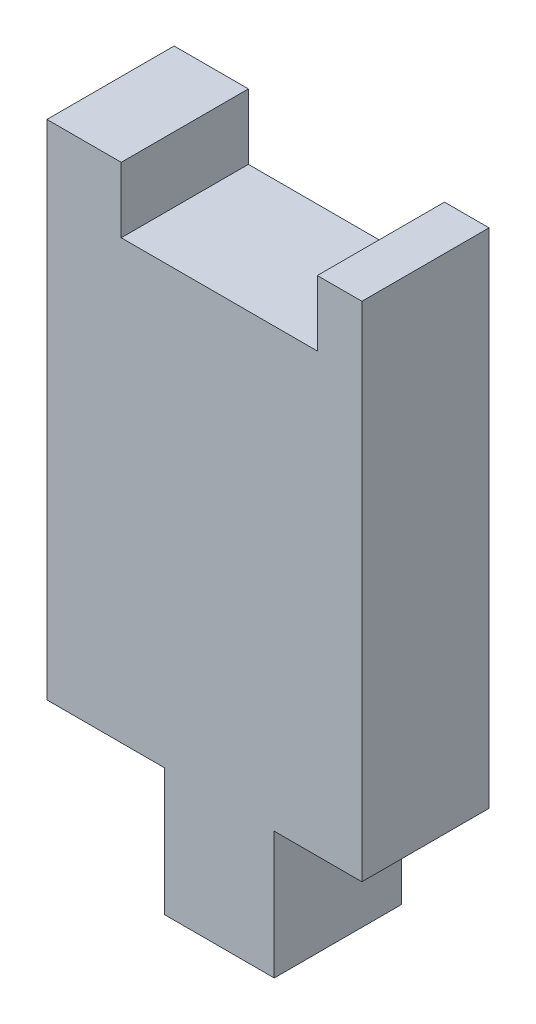
ISO-10303-21;
HEADER;
FILE_DESCRIPTION(('STEP AP214'),'2;1');
FILE_NAME('part.step','',(''),(''),'','','');
FILE_SCHEMA(('AUTOMOTIVE_DESIGN { 1 0 10303 214 1 1 1 1 }'));
ENDSEC;
DATA;
#1=APPLICATION_CONTEXT('core data for automotive mechanical design processes');
#2=APPLICATION_PROTOCOL_DEFINITION('international standard','automotive_design',2000,#1);
#3=PRODUCT_CONTEXT('',#1,'mechanical');
#4=PRODUCT('Part','Part','',(#3));
#5=PRODUCT_RELATED_PRODUCT_CATEGORY('part','',(#4));
#6=PRODUCT_DEFINITION_FORMATION('','',#4);
#7=PRODUCT_DEFINITION_CONTEXT('part definition',#1,'design');
#8=PRODUCT_DEFINITION('design','',#6,#7);
#9=PRODUCT_DEFINITION_SHAPE('','',#8);
#10=(LENGTH_UNIT() NAMED_UNIT(*) SI_UNIT(.MILLI.,.METRE.));
#11=(NAMED_UNIT(*) PLANE_ANGLE_UNIT() SI_UNIT($,.RADIAN.));
#12=(NAMED_UNIT(*) SI_UNIT($,.STERADIAN.) SOLID_ANGLE_UNIT());
#13=UNCERTAINTY_MEASURE_WITH_UNIT(LENGTH_MEASURE(1.E-05),#10,'distance_accuracy_value','');
#14=(GEOMETRIC_REPRESENTATION_CONTEXT(3) GLOBAL_UNCERTAINTY_ASSIGNED_CONTEXT((#13)) GLOBAL_UNIT_ASSIGNED_CONTEXT((#10,
#11,#12)) REPRESENTATION_CONTEXT('',''));
#15=CARTESIAN_POINT('',(0.,0.,0.));
#16=DIRECTION('',(0.,0.,1.));
#17=DIRECTION('',(1.,0.,0.));
#18=AXIS2_PLACEMENT_3D('',#15,#16,#17);
#19=CARTESIAN_POINT('',(0.,0.,5.4356));
#20=DIRECTION('',(0.,1.,0.));
#21=DIRECTION('',(0.,0.,1.));
#22=AXIS2_PLACEMENT_3D('',#19,#20,#21);
#23=PLANE('',#22);
#24=DIRECTION('',(1.,0.,0.));
#25=VECTOR('',#24,1.);
#26=CARTESIAN_POINT('',(0.,0.,0.));
#27=LINE('',#26,#25);
#28=CARTESIAN_POINT('',(3.7465,0.,0.));
#29=VERTEX_POINT('',#28);
#30=CARTESIAN_POINT('',(8.4455,0.,0.));
#31=VERTEX_POINT('',#30);
#32=EDGE_CURVE('E201',#29,#31,#27,.T.);
#33=ORIENTED_EDGE('',*,*,#32,.T.);
#34=DIRECTION('',(0.,0.,1.));
#35=VECTOR('',#34,1.);
#36=CARTESIAN_POINT('',(8.4455,0.,0.));
#37=LINE('',#36,#35);
#38=CARTESIAN_POINT('',(8.4455,0.,5.4356));
#39=VERTEX_POINT('',#38);
#40=EDGE_CURVE('E183',#31,#39,#37,.T.);
#41=ORIENTED_EDGE('',*,*,#40,.T.);
#42=DIRECTION('',(1.,0.,0.));
#43=VECTOR('',#42,1.);
#44=CARTESIAN_POINT('',(0.,0.,5.4356));
#45=LINE('',#44,#43);
#46=CARTESIAN_POINT('',(3.7465,0.,5.4356));
#47=VERTEX_POINT('',#46);
#48=EDGE_CURVE('E203',#47,#39,#45,.T.);
#49=ORIENTED_EDGE('',*,*,#48,.F.);
#50=DIRECTION('',(0.,0.,1.));
#51=VECTOR('',#50,1.);
#52=CARTESIAN_POINT('',(3.7465,0.,0.));
#53=LINE('',#52,#51);
#54=EDGE_CURVE('E194',#29,#47,#53,.T.);
#55=ORIENTED_EDGE('',*,*,#54,.F.);
#56=EDGE_LOOP('',(#33,#41,#49,#55));
#57=FACE_BOUND('',#56,.T.);
#58=ADVANCED_FACE('F32',(#57),#23,.F.);
#59=CARTESIAN_POINT('',(12.192,0.,5.4356));
#60=DIRECTION('',(-1.,0.,0.));
#61=DIRECTION('',(0.,-1.,0.));
#62=AXIS2_PLACEMENT_3D('',#59,#60,#61);
#63=PLANE('',#62);
#64=DIRECTION('',(0.,1.,0.));
#65=VECTOR('',#64,1.);
#66=CARTESIAN_POINT('',(12.192,0.,0.));
#67=LINE('',#66,#65);
#68=CARTESIAN_POINT('',(12.192,5.4356,0.));
#69=VERTEX_POINT('',#68);
#70=CARTESIAN_POINT('',(12.192,26.924,0.));
#71=VERTEX_POINT('',#70);
#72=EDGE_CURVE('E207',#69,#71,#67,.T.);
#73=ORIENTED_EDGE('',*,*,#72,.T.);
#74=DIRECTION('',(0.,0.,1.));
#75=VECTOR('',#74,1.);
#76=CARTESIAN_POINT('',(12.192,26.924,-4.99999999997031E-05));
#77=LINE('',#76,#75);
#78=CARTESIAN_POINT('',(12.192,26.924,5.4356));
#79=VERTEX_POINT('',#78);
#80=EDGE_CURVE('E151',#71,#79,#77,.T.);
#81=ORIENTED_EDGE('',*,*,#80,.T.);
#82=DIRECTION('',(0.,1.,0.));
#83=VECTOR('',#82,1.);
#84=CARTESIAN_POINT('',(12.192,0.,5.4356));
#85=LINE('',#84,#83);
#86=CARTESIAN_POINT('',(12.192,5.4356,5.4356));
#87=VERTEX_POINT('',#86);
#88=EDGE_CURVE('E206',#87,#79,#85,.T.);
#89=ORIENTED_EDGE('',*,*,#88,.F.);
#90=DIRECTION('',(0.,0.,1.));
#91=VECTOR('',#90,1.);
#92=CARTESIAN_POINT('',(12.192,5.4356,0.));
#93=LINE('',#92,#91);
#94=EDGE_CURVE('E180',#69,#87,#93,.T.);
#95=ORIENTED_EDGE('',*,*,#94,.F.);
#96=EDGE_LOOP('',(#73,#81,#89,#95));
#97=FACE_BOUND('',#96,.T.);
#98=ADVANCED_FACE('F254',(#97),#63,.F.);
#99=CARTESIAN_POINT('',(0.,0.,5.4356));
#100=DIRECTION('',(0.,0.,-1.));
#101=DIRECTION('',(-1.,0.,0.));
#102=AXIS2_PLACEMENT_3D('',#99,#100,#101);
#103=PLANE('',#102);
#104=DIRECTION('',(1.,0.,0.));
#105=VECTOR('',#104,1.);
#106=CARTESIAN_POINT('',(1.905,24.13,5.4356));
#107=LINE('',#106,#105);
#108=CARTESIAN_POINT('',(1.905,24.13,5.4356));
#109=VERTEX_POINT('',#108);
#110=CARTESIAN_POINT('',(10.287,24.13,5.4356));
#111=VERTEX_POINT('',#110);
#112=EDGE_CURVE('E137',#109,#111,#107,.T.);
#113=ORIENTED_EDGE('',*,*,#112,.F.);
#114=DIRECTION('',(0.,1.,0.));
#115=VECTOR('',#114,1.);
#116=CARTESIAN_POINT('',(1.905,27.178,5.4356));
#117=LINE('',#116,#115);
#118=CARTESIAN_POINT('',(1.905,26.924,5.4356));
#119=VERTEX_POINT('',#118);
#120=EDGE_CURVE('E121',#109,#119,#117,.T.);
#121=ORIENTED_EDGE('',*,*,#120,.T.);
#122=DIRECTION('',(1.,0.,0.));
#123=VECTOR('',#122,1.);
#124=CARTESIAN_POINT('',(-1.27,26.924,5.4356));
#125=LINE('',#124,#123);
#126=CARTESIAN_POINT('',(-1.27,26.924,5.4356));
#127=VERTEX_POINT('',#126);
#128=EDGE_CURVE('E155',#127,#119,#125,.T.);
#129=ORIENTED_EDGE('',*,*,#128,.F.);
#130=DIRECTION('',(0.,-1.,0.));
#131=VECTOR('',#130,1.);
#132=CARTESIAN_POINT('',(-1.27,27.178,5.4356));
#133=LINE('',#132,#131);
#134=CARTESIAN_POINT('',(-1.27,5.4356,5.4356));
#135=VERTEX_POINT('',#134);
#136=EDGE_CURVE('E159',#127,#135,#133,.T.);
#137=ORIENTED_EDGE('',*,*,#136,.T.);
#138=DIRECTION('',(-1.,0.,0.));
#139=VECTOR('',#138,1.);
#140=CARTESIAN_POINT('',(3.7465,5.4356,5.4356));
#141=LINE('',#140,#139);
#142=CARTESIAN_POINT('',(3.7465,5.4356,5.4356));
#143=VERTEX_POINT('',#142);
#144=EDGE_CURVE('E191',#143,#135,#141,.T.);
#145=ORIENTED_EDGE('',*,*,#144,.F.);
#146=DIRECTION('',(0.,1.,0.));
#147=VECTOR('',#146,1.);
#148=CARTESIAN_POINT('',(3.7465,0.,5.4356));
#149=LINE('',#148,#147);
#150=EDGE_CURVE('E182',#47,#143,#149,.T.);
#151=ORIENTED_EDGE('',*,*,#150,.F.);
#152=ORIENTED_EDGE('',*,*,#48,.T.);
#153=DIRECTION('',(0.,-1.,0.));
#154=VECTOR('',#153,1.);
#155=CARTESIAN_POINT('',(8.4455,0.,5.4356));
#156=LINE('',#155,#154);
#157=CARTESIAN_POINT('',(8.4455,5.4356,5.4356));
#158=VERTEX_POINT('',#157);
#159=EDGE_CURVE('E172',#158,#39,#156,.T.);
#160=ORIENTED_EDGE('',*,*,#159,.F.);
#161=DIRECTION('',(-1.,0.,0.));
#162=VECTOR('',#161,1.);
#163=CARTESIAN_POINT('',(8.4455,5.4356,5.4356));
#164=LINE('',#163,#162);
#165=EDGE_CURVE('E176',#87,#158,#164,.T.);
#166=ORIENTED_EDGE('',*,*,#165,.F.);
#167=ORIENTED_EDGE('',*,*,#88,.T.);
#168=DIRECTION('',(1.,0.,0.));
#169=VECTOR('',#168,1.);
#170=CARTESIAN_POINT('',(10.287,26.924,5.4356));
#171=LINE('',#170,#169);
#172=CARTESIAN_POINT('',(10.287,26.924,5.4356));
#173=VERTEX_POINT('',#172);
#174=EDGE_CURVE('E148',#173,#79,#171,.T.);
#175=ORIENTED_EDGE('',*,*,#174,.F.);
#176=DIRECTION('',(0.,-1.,0.));
#177=VECTOR('',#176,1.);
#178=CARTESIAN_POINT('',(10.287,27.178,5.4356));
#179=LINE('',#178,#177);
#180=EDGE_CURVE('E144',#173,#111,#179,.T.);
#181=ORIENTED_EDGE('',*,*,#180,.T.);
#182=EDGE_LOOP('',(#113,#121,#129,#137,#145,#151,#152,#160,#166,#167,#175,#181));
#183=FACE_BOUND('',#182,.T.);
#184=ADVANCED_FACE('F141',(#183),#103,.F.);
#185=CARTESIAN_POINT('',(0.,0.,0.));
#186=DIRECTION('',(0.,0.,-1.));
#187=DIRECTION('',(-1.,0.,0.));
#188=AXIS2_PLACEMENT_3D('',#185,#186,#187);
#189=PLANE('',#188);
#190=DIRECTION('',(0.,1.,0.));
#191=VECTOR('',#190,1.);
#192=CARTESIAN_POINT('',(1.905,27.178,0.));
#193=LINE('',#192,#191);
#194=CARTESIAN_POINT('',(1.905,24.13,0.));
#195=VERTEX_POINT('',#194);
#196=CARTESIAN_POINT('',(1.905,26.924,0.));
#197=VERTEX_POINT('',#196);
#198=EDGE_CURVE('E130',#195,#197,#193,.T.);
#199=ORIENTED_EDGE('',*,*,#198,.F.);
#200=DIRECTION('',(-1.,0.,0.));
#201=VECTOR('',#200,1.);
#202=CARTESIAN_POINT('',(0.,24.13,0.));
#203=LINE('',#202,#201);
#204=CARTESIAN_POINT('',(10.287,24.13,0.));
#205=VERTEX_POINT('',#204);
#206=EDGE_CURVE('E11',#205,#195,#203,.T.);
#207=ORIENTED_EDGE('',*,*,#206,.F.);
#208=DIRECTION('',(0.,-1.,0.));
#209=VECTOR('',#208,1.);
#210=CARTESIAN_POINT('',(10.287,27.178,0.));
#211=LINE('',#210,#209);
#212=CARTESIAN_POINT('',(10.287,26.924,0.));
#213=VERTEX_POINT('',#212);
#214=EDGE_CURVE('E131',#213,#205,#211,.T.);
#215=ORIENTED_EDGE('',*,*,#214,.F.);
#216=DIRECTION('',(-1.,0.,0.));
#217=VECTOR('',#216,1.);
#218=CARTESIAN_POINT('',(0.,26.924,0.));
#219=LINE('',#218,#217);
#220=EDGE_CURVE('E46',#71,#213,#219,.T.);
#221=ORIENTED_EDGE('',*,*,#220,.F.);
#222=ORIENTED_EDGE('',*,*,#72,.F.);
#223=DIRECTION('',(-1.,0.,0.));
#224=VECTOR('',#223,1.);
#225=CARTESIAN_POINT('',(8.4455,5.4356,0.));
#226=LINE('',#225,#224);
#227=CARTESIAN_POINT('',(8.4455,5.4356,0.));
#228=VERTEX_POINT('',#227);
#229=EDGE_CURVE('E168',#69,#228,#226,.T.);
#230=ORIENTED_EDGE('',*,*,#229,.T.);
#231=DIRECTION('',(0.,-1.,0.));
#232=VECTOR('',#231,1.);
#233=CARTESIAN_POINT('',(8.4455,0.,0.));
#234=LINE('',#233,#232);
#235=EDGE_CURVE('E171',#228,#31,#234,.T.);
#236=ORIENTED_EDGE('',*,*,#235,.T.);
#237=ORIENTED_EDGE('',*,*,#32,.F.);
#238=DIRECTION('',(0.,1.,0.));
#239=VECTOR('',#238,1.);
#240=CARTESIAN_POINT('',(3.7465,0.,0.));
#241=LINE('',#240,#239);
#242=CARTESIAN_POINT('',(3.7465,5.4356,0.));
#243=VERTEX_POINT('',#242);
#244=EDGE_CURVE('E187',#29,#243,#241,.T.);
#245=ORIENTED_EDGE('',*,*,#244,.T.);
#246=DIRECTION('',(-1.,0.,0.));
#247=VECTOR('',#246,1.);
#248=CARTESIAN_POINT('',(3.7465,5.4356,0.));
#249=LINE('',#248,#247);
#250=CARTESIAN_POINT('',(-1.27,5.4356,0.));
#251=VERTEX_POINT('',#250);
#252=EDGE_CURVE('E190',#243,#251,#249,.T.);
#253=ORIENTED_EDGE('',*,*,#252,.T.);
#254=DIRECTION('',(0.,-1.,0.));
#255=VECTOR('',#254,1.);
#256=CARTESIAN_POINT('',(-1.27,27.178,0.));
#257=LINE('',#256,#255);
#258=CARTESIAN_POINT('',(-1.27,26.924,0.));
#259=VERTEX_POINT('',#258);
#260=EDGE_CURVE('E161',#259,#251,#257,.T.);
#261=ORIENTED_EDGE('',*,*,#260,.F.);
#262=DIRECTION('',(-1.,0.,0.));
#263=VECTOR('',#262,1.);
#264=CARTESIAN_POINT('',(0.,26.924,0.));
#265=LINE('',#264,#263);
#266=EDGE_CURVE('E54',#197,#259,#265,.T.);
#267=ORIENTED_EDGE('',*,*,#266,.F.);
#268=EDGE_LOOP('',(#199,#207,#215,#221,#222,#230,#236,#237,#245,#253,#261,#267));
#269=FACE_BOUND('',#268,.T.);
#270=ADVANCED_FACE('F227',(#269),#189,.T.);
#271=CARTESIAN_POINT('',(3.7465,5.4356,0.));
#272=DIRECTION('',(0.,1.,0.));
#273=DIRECTION('',(0.,0.,1.));
#274=AXIS2_PLACEMENT_3D('',#271,#272,#273);
#275=PLANE('',#274);
#276=ORIENTED_EDGE('',*,*,#144,.T.);
#277=DIRECTION('',(0.,0.,1.));
#278=VECTOR('',#277,1.);
#279=CARTESIAN_POINT('',(-1.27,5.4356,-21.7794595378306));
#280=LINE('',#279,#278);
#281=EDGE_CURVE('E163',#251,#135,#280,.T.);
#282=ORIENTED_EDGE('',*,*,#281,.F.);
#283=ORIENTED_EDGE('',*,*,#252,.F.);
#284=DIRECTION('',(0.,0.,1.));
#285=VECTOR('',#284,1.);
#286=CARTESIAN_POINT('',(3.7465,5.4356,0.));
#287=LINE('',#286,#285);
#288=EDGE_CURVE('E199',#243,#143,#287,.T.);
#289=ORIENTED_EDGE('',*,*,#288,.T.);
#290=EDGE_LOOP('',(#276,#282,#283,#289));
#291=FACE_BOUND('',#290,.T.);
#292=ADVANCED_FACE('F237',(#291),#275,.F.);
#293=CARTESIAN_POINT('',(3.7465,0.,0.));
#294=DIRECTION('',(1.,0.,0.));
#295=DIRECTION('',(0.,0.,-1.));
#296=AXIS2_PLACEMENT_3D('',#293,#294,#295);
#297=PLANE('',#296);
#298=ORIENTED_EDGE('',*,*,#150,.T.);
#299=ORIENTED_EDGE('',*,*,#288,.F.);
#300=ORIENTED_EDGE('',*,*,#244,.F.);
#301=ORIENTED_EDGE('',*,*,#54,.T.);
#302=EDGE_LOOP('',(#298,#299,#300,#301));
#303=FACE_BOUND('',#302,.T.);
#304=ADVANCED_FACE('F240',(#303),#297,.F.);
#305=CARTESIAN_POINT('',(8.4455,5.4356,0.));
#306=DIRECTION('',(0.,1.,0.));
#307=DIRECTION('',(-1.,0.,0.));
#308=AXIS2_PLACEMENT_3D('',#305,#306,#307);
#309=PLANE('',#308);
#310=ORIENTED_EDGE('',*,*,#165,.T.);
#311=DIRECTION('',(0.,0.,1.));
#312=VECTOR('',#311,1.);
#313=CARTESIAN_POINT('',(8.4455,5.4356,0.));
#314=LINE('',#313,#312);
#315=EDGE_CURVE('E175',#228,#158,#314,.T.);
#316=ORIENTED_EDGE('',*,*,#315,.F.);
#317=ORIENTED_EDGE('',*,*,#229,.F.);
#318=ORIENTED_EDGE('',*,*,#94,.T.);
#319=EDGE_LOOP('',(#310,#316,#317,#318));
#320=FACE_BOUND('',#319,.T.);
#321=ADVANCED_FACE('F252',(#320),#309,.F.);
#322=CARTESIAN_POINT('',(8.4455,0.,0.));
#323=DIRECTION('',(-1.,0.,0.));
#324=DIRECTION('',(0.,0.,1.));
#325=AXIS2_PLACEMENT_3D('',#322,#323,#324);
#326=PLANE('',#325);
#327=ORIENTED_EDGE('',*,*,#159,.T.);
#328=ORIENTED_EDGE('',*,*,#40,.F.);
#329=ORIENTED_EDGE('',*,*,#235,.F.);
#330=ORIENTED_EDGE('',*,*,#315,.T.);
#331=EDGE_LOOP('',(#327,#328,#329,#330));
#332=FACE_BOUND('',#331,.T.);
#333=ADVANCED_FACE('F248',(#332),#326,.F.);
#334=CARTESIAN_POINT('',(1.905,27.178,-3.38163584674637));
#335=DIRECTION('',(1.,0.,0.));
#336=DIRECTION('',(0.,1.,0.));
#337=AXIS2_PLACEMENT_3D('',#334,#335,#336);
#338=PLANE('',#337);
#339=DIRECTION('',(0.,0.,1.));
#340=VECTOR('',#339,1.);
#341=CARTESIAN_POINT('',(1.905,26.924,-4.99999999997031E-05));
#342=LINE('',#341,#340);
#343=EDGE_CURVE('E126',#197,#119,#342,.T.);
#344=ORIENTED_EDGE('',*,*,#343,.T.);
#345=ORIENTED_EDGE('',*,*,#120,.F.);
#346=DIRECTION('',(0.,0.,1.));
#347=VECTOR('',#346,1.);
#348=CARTESIAN_POINT('',(1.905,24.13,-4.99999999997031E-05));
#349=LINE('',#348,#347);
#350=EDGE_CURVE('E125',#195,#109,#349,.T.);
#351=ORIENTED_EDGE('',*,*,#350,.F.);
#352=ORIENTED_EDGE('',*,*,#198,.T.);
#353=EDGE_LOOP('',(#344,#345,#351,#352));
#354=FACE_BOUND('',#353,.T.);
#355=ADVANCED_FACE('F123',(#354),#338,.T.);
#356=CARTESIAN_POINT('',(10.287,27.178,-3.38163584674637));
#357=DIRECTION('',(-1.,0.,0.));
#358=DIRECTION('',(0.,-1.,0.));
#359=AXIS2_PLACEMENT_3D('',#356,#357,#358);
#360=PLANE('',#359);
#361=DIRECTION('',(0.,0.,1.));
#362=VECTOR('',#361,1.);
#363=CARTESIAN_POINT('',(10.287,26.924,-3.38163584674637));
#364=LINE('',#363,#362);
#365=EDGE_CURVE('E39',#213,#173,#364,.T.);
#366=ORIENTED_EDGE('',*,*,#365,.F.);
#367=ORIENTED_EDGE('',*,*,#214,.T.);
#368=DIRECTION('',(0.,0.,1.));
#369=VECTOR('',#368,1.);
#370=CARTESIAN_POINT('',(10.287,24.13,-4.99999999997031E-05));
#371=LINE('',#370,#369);
#372=EDGE_CURVE('E139',#205,#111,#371,.T.);
#373=ORIENTED_EDGE('',*,*,#372,.T.);
#374=ORIENTED_EDGE('',*,*,#180,.F.);
#375=EDGE_LOOP('',(#366,#367,#373,#374));
#376=FACE_BOUND('',#375,.T.);
#377=ADVANCED_FACE('F225',(#376),#360,.T.);
#378=CARTESIAN_POINT('',(-1.27,27.178,-21.7794595378306));
#379=DIRECTION('',(-1.,0.,0.));
#380=DIRECTION('',(0.,-1.,0.));
#381=AXIS2_PLACEMENT_3D('',#378,#379,#380);
#382=PLANE('',#381);
#383=DIRECTION('',(0.,0.,1.));
#384=VECTOR('',#383,1.);
#385=CARTESIAN_POINT('',(-1.27,26.924,-21.7794595378306));
#386=LINE('',#385,#384);
#387=EDGE_CURVE('E210',#259,#127,#386,.T.);
#388=ORIENTED_EDGE('',*,*,#387,.F.);
#389=ORIENTED_EDGE('',*,*,#260,.T.);
#390=ORIENTED_EDGE('',*,*,#281,.T.);
#391=ORIENTED_EDGE('',*,*,#136,.F.);
#392=EDGE_LOOP('',(#388,#389,#390,#391));
#393=FACE_BOUND('',#392,.T.);
#394=ADVANCED_FACE('F231',(#393),#382,.T.);
#395=CARTESIAN_POINT('',(-1.27,26.924,-4.99999999997031E-05));
#396=DIRECTION('',(0.,-1.,0.));
#397=DIRECTION('',(0.,0.,-1.));
#398=AXIS2_PLACEMENT_3D('',#395,#396,#397);
#399=PLANE('',#398);
#400=ORIENTED_EDGE('',*,*,#266,.T.);
#401=ORIENTED_EDGE('',*,*,#387,.T.);
#402=ORIENTED_EDGE('',*,*,#128,.T.);
#403=ORIENTED_EDGE('',*,*,#343,.F.);
#404=EDGE_LOOP('',(#400,#401,#402,#403));
#405=FACE_BOUND('',#404,.T.);
#406=ADVANCED_FACE('F233',(#405),#399,.F.);
#407=CARTESIAN_POINT('',(10.287,26.924,-4.99999999997031E-05));
#408=DIRECTION('',(0.,-1.,0.));
#409=DIRECTION('',(0.,0.,-1.));
#410=AXIS2_PLACEMENT_3D('',#407,#408,#409);
#411=PLANE('',#410);
#412=ORIENTED_EDGE('',*,*,#220,.T.);
#413=ORIENTED_EDGE('',*,*,#365,.T.);
#414=ORIENTED_EDGE('',*,*,#174,.T.);
#415=ORIENTED_EDGE('',*,*,#80,.F.);
#416=EDGE_LOOP('',(#412,#413,#414,#415));
#417=FACE_BOUND('',#416,.T.);
#418=ADVANCED_FACE('F220',(#417),#411,.F.);
#419=CARTESIAN_POINT('',(1.905,24.13,-4.99999999997031E-05));
#420=DIRECTION('',(0.,-1.,0.));
#421=DIRECTION('',(0.,0.,-1.));
#422=AXIS2_PLACEMENT_3D('',#419,#420,#421);
#423=PLANE('',#422);
#424=ORIENTED_EDGE('',*,*,#206,.T.);
#425=ORIENTED_EDGE('',*,*,#350,.T.);
#426=ORIENTED_EDGE('',*,*,#112,.T.);
#427=ORIENTED_EDGE('',*,*,#372,.F.);
#428=EDGE_LOOP('',(#424,#425,#426,#427));
#429=FACE_BOUND('',#428,.T.);
#430=ADVANCED_FACE('F135',(#429),#423,.F.);
#431=CLOSED_SHELL('',(#58,#98,#184,#270,#292,#304,#321,#333,#355,#377,#394,#406,#418,#430));
#432=MANIFOLD_SOLID_BREP('B2',#431);
#433=ADVANCED_BREP_SHAPE_REPRESENTATION('',(#18,#432),#14);
#434=SHAPE_DEFINITION_REPRESENTATION(#9,#433);
ENDSEC;
END-ISO-10303-21;
